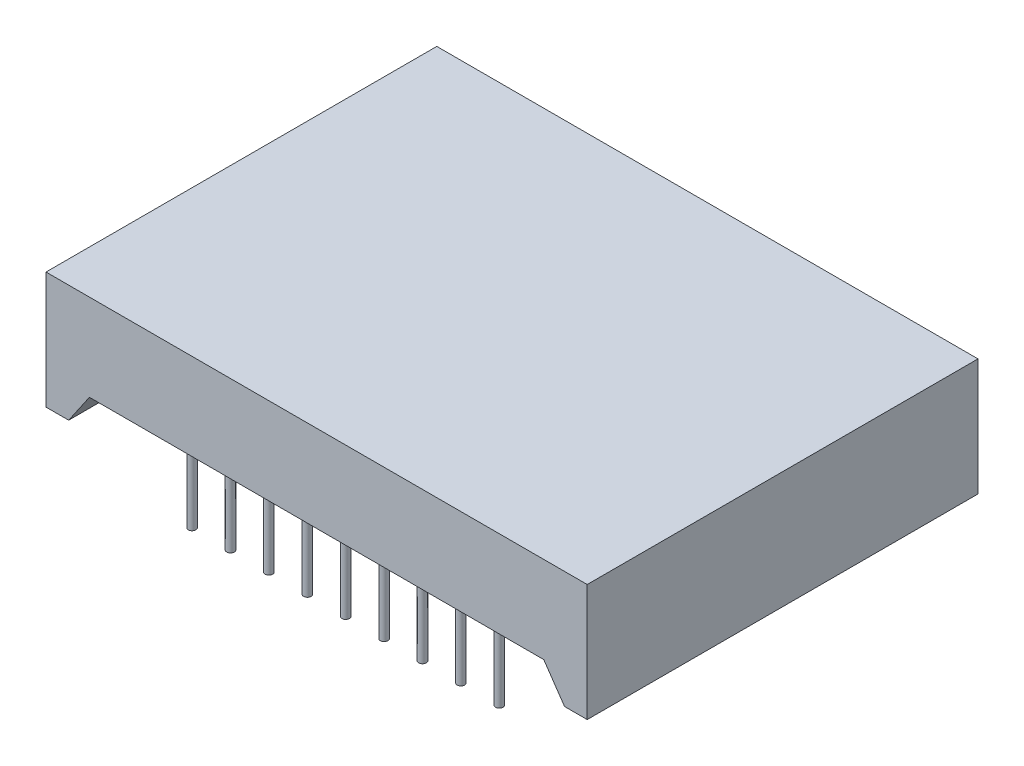
ISO-10303-21;
HEADER;
FILE_DESCRIPTION(('STEP AP214'),'2;1');
FILE_NAME('part.step','',(''),(''),'','','');
FILE_SCHEMA(('AUTOMOTIVE_DESIGN { 1 0 10303 214 1 1 1 1 }'));
ENDSEC;
DATA;
#1=APPLICATION_CONTEXT('core data for automotive mechanical design processes');
#2=APPLICATION_PROTOCOL_DEFINITION('international standard','automotive_design',2000,#1);
#3=PRODUCT_CONTEXT('',#1,'mechanical');
#4=PRODUCT('Part','Part','',(#3));
#5=PRODUCT_RELATED_PRODUCT_CATEGORY('part','',(#4));
#6=PRODUCT_DEFINITION_FORMATION('','',#4);
#7=PRODUCT_DEFINITION_CONTEXT('part definition',#1,'design');
#8=PRODUCT_DEFINITION('design','',#6,#7);
#9=PRODUCT_DEFINITION_SHAPE('','',#8);
#10=(LENGTH_UNIT() NAMED_UNIT(*) SI_UNIT(.MILLI.,.METRE.));
#11=(NAMED_UNIT(*) PLANE_ANGLE_UNIT() SI_UNIT($,.RADIAN.));
#12=(NAMED_UNIT(*) SI_UNIT($,.STERADIAN.) SOLID_ANGLE_UNIT());
#13=UNCERTAINTY_MEASURE_WITH_UNIT(LENGTH_MEASURE(1.E-05),#10,'distance_accuracy_value','');
#14=(GEOMETRIC_REPRESENTATION_CONTEXT(3) GLOBAL_UNCERTAINTY_ASSIGNED_CONTEXT((#13)) GLOBAL_UNIT_ASSIGNED_CONTEXT((#10,
#11,#12)) REPRESENTATION_CONTEXT('',''));
#15=CARTESIAN_POINT('',(0.,0.,0.));
#16=DIRECTION('',(0.,0.,1.));
#17=DIRECTION('',(1.,0.,0.));
#18=AXIS2_PLACEMENT_3D('',#15,#16,#17);
#19=CARTESIAN_POINT('',(0.,7.74,12.925));
#20=DIRECTION('',(0.,0.,1.));
#21=DIRECTION('',(1.,0.,0.));
#22=AXIS2_PLACEMENT_3D('',#19,#20,#21);
#23=PLANE('',#22);
#24=DIRECTION('',(-1.,0.,0.));
#25=VECTOR('',#24,1.);
#26=CARTESIAN_POINT('',(0.,0.,12.925));
#27=LINE('',#26,#25);
#28=CARTESIAN_POINT('',(-16.4,0.,12.925));
#29=VERTEX_POINT('',#28);
#30=CARTESIAN_POINT('',(-17.9,0.,12.925));
#31=VERTEX_POINT('',#30);
#32=EDGE_CURVE('E377',#29,#31,#27,.T.);
#33=ORIENTED_EDGE('',*,*,#32,.F.);
#34=DIRECTION('',(0.56579801906661,0.824543874891022,0.));
#35=VECTOR('',#34,1.);
#36=CARTESIAN_POINT('',(-7.53900491387033,12.9132287097094,12.925));
#37=LINE('',#36,#35);
#38=CARTESIAN_POINT('',(-15.0276096729446,2.,12.925));
#39=VERTEX_POINT('',#38);
#40=EDGE_CURVE('E320',#29,#39,#37,.T.);
#41=ORIENTED_EDGE('',*,*,#40,.T.);
#42=DIRECTION('',(1.,0.,0.));
#43=VECTOR('',#42,1.);
#44=CARTESIAN_POINT('',(0.,2.,12.925));
#45=LINE('',#44,#43);
#46=CARTESIAN_POINT('',(15.0276096729446,2.,12.925));
#47=VERTEX_POINT('',#46);
#48=EDGE_CURVE('E324',#39,#47,#45,.T.);
#49=ORIENTED_EDGE('',*,*,#48,.T.);
#50=DIRECTION('',(0.56579801906661,-0.824543874891021,0.));
#51=VECTOR('',#50,1.);
#52=CARTESIAN_POINT('',(7.53900491387033,12.9132287097094,12.925));
#53=LINE('',#52,#51);
#54=CARTESIAN_POINT('',(16.4,0.,12.925));
#55=VERTEX_POINT('',#54);
#56=EDGE_CURVE('E379',#47,#55,#53,.T.);
#57=ORIENTED_EDGE('',*,*,#56,.T.);
#58=CARTESIAN_POINT('',(17.9,0.,12.925));
#59=VERTEX_POINT('',#58);
#60=EDGE_CURVE('E370',#59,#55,#27,.T.);
#61=ORIENTED_EDGE('',*,*,#60,.F.);
#62=DIRECTION('',(0.,-1.,0.));
#63=VECTOR('',#62,1.);
#64=CARTESIAN_POINT('',(17.9,7.74,12.925));
#65=LINE('',#64,#63);
#66=CARTESIAN_POINT('',(17.9,7.74,12.925));
#67=VERTEX_POINT('',#66);
#68=EDGE_CURVE('E395',#67,#59,#65,.T.);
#69=ORIENTED_EDGE('',*,*,#68,.F.);
#70=DIRECTION('',(-1.,0.,0.));
#71=VECTOR('',#70,1.);
#72=CARTESIAN_POINT('',(0.,7.74,12.925));
#73=LINE('',#72,#71);
#74=CARTESIAN_POINT('',(-17.9,7.74,12.925));
#75=VERTEX_POINT('',#74);
#76=EDGE_CURVE('E502',#67,#75,#73,.T.);
#77=ORIENTED_EDGE('',*,*,#76,.T.);
#78=DIRECTION('',(0.,-1.,0.));
#79=VECTOR('',#78,1.);
#80=CARTESIAN_POINT('',(-17.9,7.74,12.925));
#81=LINE('',#80,#79);
#82=EDGE_CURVE('E389',#75,#31,#81,.T.);
#83=ORIENTED_EDGE('',*,*,#82,.T.);
#84=EDGE_LOOP('',(#33,#41,#49,#57,#61,#69,#77,#83));
#85=FACE_BOUND('',#84,.T.);
#86=ADVANCED_FACE('F305',(#85),#23,.T.);
#87=CARTESIAN_POINT('',(0.,7.74,-12.925));
#88=DIRECTION('',(0.,0.,1.));
#89=DIRECTION('',(1.,0.,0.));
#90=AXIS2_PLACEMENT_3D('',#87,#88,#89);
#91=PLANE('',#90);
#92=DIRECTION('',(0.56579801906661,0.824543874891022,0.));
#93=VECTOR('',#92,1.);
#94=CARTESIAN_POINT('',(-7.53900491387033,12.9132287097094,-12.925));
#95=LINE('',#94,#93);
#96=CARTESIAN_POINT('',(-16.4,0.,-12.925));
#97=VERTEX_POINT('',#96);
#98=CARTESIAN_POINT('',(-15.0276096729446,2.,-12.925));
#99=VERTEX_POINT('',#98);
#100=EDGE_CURVE('E383',#97,#99,#95,.T.);
#101=ORIENTED_EDGE('',*,*,#100,.F.);
#102=DIRECTION('',(-1.,0.,0.));
#103=VECTOR('',#102,1.);
#104=CARTESIAN_POINT('',(0.,0.,-12.925));
#105=LINE('',#104,#103);
#106=CARTESIAN_POINT('',(-17.9,0.,-12.925));
#107=VERTEX_POINT('',#106);
#108=EDGE_CURVE('E515',#97,#107,#105,.T.);
#109=ORIENTED_EDGE('',*,*,#108,.T.);
#110=DIRECTION('',(0.,-1.,0.));
#111=VECTOR('',#110,1.);
#112=CARTESIAN_POINT('',(-17.9,7.74,-12.925));
#113=LINE('',#112,#111);
#114=CARTESIAN_POINT('',(-17.9,7.74,-12.925));
#115=VERTEX_POINT('',#114);
#116=EDGE_CURVE('E511',#115,#107,#113,.T.);
#117=ORIENTED_EDGE('',*,*,#116,.F.);
#118=DIRECTION('',(-1.,0.,0.));
#119=VECTOR('',#118,1.);
#120=CARTESIAN_POINT('',(0.,7.74,-12.925));
#121=LINE('',#120,#119);
#122=CARTESIAN_POINT('',(17.9,7.74,-12.925));
#123=VERTEX_POINT('',#122);
#124=EDGE_CURVE('E509',#123,#115,#121,.T.);
#125=ORIENTED_EDGE('',*,*,#124,.F.);
#126=DIRECTION('',(0.,-1.,0.));
#127=VECTOR('',#126,1.);
#128=CARTESIAN_POINT('',(17.9,7.74,-12.925));
#129=LINE('',#128,#127);
#130=CARTESIAN_POINT('',(17.9,0.,-12.925));
#131=VERTEX_POINT('',#130);
#132=EDGE_CURVE('E519',#123,#131,#129,.T.);
#133=ORIENTED_EDGE('',*,*,#132,.T.);
#134=CARTESIAN_POINT('',(16.4,0.,-12.925));
#135=VERTEX_POINT('',#134);
#136=EDGE_CURVE('E503',#131,#135,#105,.T.);
#137=ORIENTED_EDGE('',*,*,#136,.T.);
#138=DIRECTION('',(0.56579801906661,-0.824543874891021,0.));
#139=VECTOR('',#138,1.);
#140=CARTESIAN_POINT('',(7.53900491387033,12.9132287097094,-12.925));
#141=LINE('',#140,#139);
#142=CARTESIAN_POINT('',(15.0276096729446,2.,-12.925));
#143=VERTEX_POINT('',#142);
#144=EDGE_CURVE('E384',#143,#135,#141,.T.);
#145=ORIENTED_EDGE('',*,*,#144,.F.);
#146=DIRECTION('',(1.,0.,0.));
#147=VECTOR('',#146,1.);
#148=CARTESIAN_POINT('',(0.,2.,-12.925));
#149=LINE('',#148,#147);
#150=EDGE_CURVE('E392',#99,#143,#149,.T.);
#151=ORIENTED_EDGE('',*,*,#150,.F.);
#152=EDGE_LOOP('',(#101,#109,#117,#125,#133,#137,#145,#151));
#153=FACE_BOUND('',#152,.T.);
#154=ADVANCED_FACE('F535',(#153),#91,.F.);
#155=CARTESIAN_POINT('',(0.,0.,0.));
#156=DIRECTION('',(0.,1.,0.));
#157=DIRECTION('',(0.,0.,1.));
#158=AXIS2_PLACEMENT_3D('',#155,#156,#157);
#159=PLANE('',#158);
#160=DIRECTION('',(0.,0.,-1.));
#161=VECTOR('',#160,1.);
#162=CARTESIAN_POINT('',(-16.4,0.,0.));
#163=LINE('',#162,#161);
#164=EDGE_CURVE('E388',#29,#97,#163,.T.);
#165=ORIENTED_EDGE('',*,*,#164,.F.);
#166=ORIENTED_EDGE('',*,*,#32,.T.);
#167=DIRECTION('',(0.,0.,-1.));
#168=VECTOR('',#167,1.);
#169=CARTESIAN_POINT('',(-17.9,0.,0.));
#170=LINE('',#169,#168);
#171=EDGE_CURVE('E488',#31,#107,#170,.T.);
#172=ORIENTED_EDGE('',*,*,#171,.T.);
#173=ORIENTED_EDGE('',*,*,#108,.F.);
#174=EDGE_LOOP('',(#165,#166,#172,#173));
#175=FACE_BOUND('',#174,.T.);
#176=ADVANCED_FACE('F533',(#175),#159,.F.);
#177=DIRECTION('',(0.,0.,1.));
#178=VECTOR('',#177,1.);
#179=CARTESIAN_POINT('',(16.4,0.,0.));
#180=LINE('',#179,#178);
#181=EDGE_CURVE('E373',#135,#55,#180,.T.);
#182=ORIENTED_EDGE('',*,*,#181,.F.);
#183=ORIENTED_EDGE('',*,*,#136,.F.);
#184=DIRECTION('',(0.,0.,-1.));
#185=VECTOR('',#184,1.);
#186=CARTESIAN_POINT('',(17.9,0.,0.));
#187=LINE('',#186,#185);
#188=EDGE_CURVE('E376',#59,#131,#187,.T.);
#189=ORIENTED_EDGE('',*,*,#188,.F.);
#190=ORIENTED_EDGE('',*,*,#60,.T.);
#191=EDGE_LOOP('',(#182,#183,#189,#190));
#192=FACE_BOUND('',#191,.T.);
#193=ADVANCED_FACE('F371',(#192),#159,.F.);
#194=CARTESIAN_POINT('',(17.9,7.74,0.));
#195=DIRECTION('',(-1.,0.,0.));
#196=DIRECTION('',(0.,0.,1.));
#197=AXIS2_PLACEMENT_3D('',#194,#195,#196);
#198=PLANE('',#197);
#199=ORIENTED_EDGE('',*,*,#188,.T.);
#200=ORIENTED_EDGE('',*,*,#132,.F.);
#201=DIRECTION('',(0.,0.,-1.));
#202=VECTOR('',#201,1.);
#203=CARTESIAN_POINT('',(17.9,7.74,0.));
#204=LINE('',#203,#202);
#205=EDGE_CURVE('E506',#67,#123,#204,.T.);
#206=ORIENTED_EDGE('',*,*,#205,.F.);
#207=ORIENTED_EDGE('',*,*,#68,.T.);
#208=EDGE_LOOP('',(#199,#200,#206,#207));
#209=FACE_BOUND('',#208,.T.);
#210=ADVANCED_FACE('F523',(#209),#198,.F.);
#211=CARTESIAN_POINT('',(-17.9,7.74,0.));
#212=DIRECTION('',(-1.,0.,0.));
#213=DIRECTION('',(0.,0.,1.));
#214=AXIS2_PLACEMENT_3D('',#211,#212,#213);
#215=PLANE('',#214);
#216=ORIENTED_EDGE('',*,*,#171,.F.);
#217=ORIENTED_EDGE('',*,*,#82,.F.);
#218=DIRECTION('',(0.,0.,-1.));
#219=VECTOR('',#218,1.);
#220=CARTESIAN_POINT('',(-17.9,7.74,0.));
#221=LINE('',#220,#219);
#222=EDGE_CURVE('E499',#75,#115,#221,.T.);
#223=ORIENTED_EDGE('',*,*,#222,.T.);
#224=ORIENTED_EDGE('',*,*,#116,.T.);
#225=EDGE_LOOP('',(#216,#217,#223,#224));
#226=FACE_BOUND('',#225,.T.);
#227=ADVANCED_FACE('F307',(#226),#215,.T.);
#228=CARTESIAN_POINT('',(0.,7.74,0.));
#229=DIRECTION('',(0.,1.,0.));
#230=DIRECTION('',(0.,0.,1.));
#231=AXIS2_PLACEMENT_3D('',#228,#229,#230);
#232=PLANE('',#231);
#233=ORIENTED_EDGE('',*,*,#222,.F.);
#234=ORIENTED_EDGE('',*,*,#76,.F.);
#235=ORIENTED_EDGE('',*,*,#205,.T.);
#236=ORIENTED_EDGE('',*,*,#124,.T.);
#237=EDGE_LOOP('',(#233,#234,#235,#236));
#238=FACE_BOUND('',#237,.T.);
#239=ADVANCED_FACE('F431',(#238),#232,.T.);
#240=CARTESIAN_POINT('',(-15.0276096729446,2.,68.9630743892043));
#241=DIRECTION('',(0.,-1.,0.));
#242=DIRECTION('',(1.,0.,0.));
#243=AXIS2_PLACEMENT_3D('',#240,#241,#242);
#244=PLANE('',#243);
#245=CARTESIAN_POINT('',(10.16,2.00000000000955,-11.));
#246=DIRECTION('',(0.,-1.,0.));
#247=DIRECTION('',(1.,0.,0.));
#248=AXIS2_PLACEMENT_3D('',#245,#246,#247);
#249=CIRCLE('',#248,0.25);
#250=CARTESIAN_POINT('',(10.41,2.00000000000955,-11.));
#251=VERTEX_POINT('',#250);
#252=EDGE_CURVE('E12',#251,#251,#249,.T.);
#253=ORIENTED_EDGE('',*,*,#252,.F.);
#254=EDGE_LOOP('',(#253));
#255=FACE_BOUND('',#254,.T.);
#256=CARTESIAN_POINT('',(7.61999999999999,2.00000000000955,-11.));
#257=DIRECTION('',(0.,-1.,0.));
#258=DIRECTION('',(1.,0.,0.));
#259=AXIS2_PLACEMENT_3D('',#256,#257,#258);
#260=CIRCLE('',#259,0.25);
#261=CARTESIAN_POINT('',(7.86999999999999,2.00000000000955,-11.));
#262=VERTEX_POINT('',#261);
#263=EDGE_CURVE('E313',#262,#262,#260,.T.);
#264=ORIENTED_EDGE('',*,*,#263,.F.);
#265=EDGE_LOOP('',(#264));
#266=FACE_BOUND('',#265,.T.);
#267=CARTESIAN_POINT('',(5.07999999999999,2.00000000000955,-11.));
#268=DIRECTION('',(0.,-1.,0.));
#269=DIRECTION('',(1.,0.,0.));
#270=AXIS2_PLACEMENT_3D('',#267,#268,#269);
#271=CIRCLE('',#270,0.25);
#272=CARTESIAN_POINT('',(5.32999999999999,2.00000000000955,-11.));
#273=VERTEX_POINT('',#272);
#274=EDGE_CURVE('E419',#273,#273,#271,.T.);
#275=ORIENTED_EDGE('',*,*,#274,.F.);
#276=EDGE_LOOP('',(#275));
#277=FACE_BOUND('',#276,.T.);
#278=CARTESIAN_POINT('',(2.54,2.00000000000955,-11.));
#279=DIRECTION('',(0.,-1.,0.));
#280=DIRECTION('',(1.,0.,0.));
#281=AXIS2_PLACEMENT_3D('',#278,#279,#280);
#282=CIRCLE('',#281,0.25);
#283=CARTESIAN_POINT('',(2.79,2.00000000000955,-11.));
#284=VERTEX_POINT('',#283);
#285=EDGE_CURVE('E416',#284,#284,#282,.T.);
#286=ORIENTED_EDGE('',*,*,#285,.F.);
#287=EDGE_LOOP('',(#286));
#288=FACE_BOUND('',#287,.T.);
#289=CARTESIAN_POINT('',(0.,2.00000000000955,-11.));
#290=DIRECTION('',(0.,-1.,0.));
#291=DIRECTION('',(1.,0.,0.));
#292=AXIS2_PLACEMENT_3D('',#289,#290,#291);
#293=CIRCLE('',#292,0.25);
#294=CARTESIAN_POINT('',(0.249999999999996,2.00000000000955,-11.));
#295=VERTEX_POINT('',#294);
#296=EDGE_CURVE('E413',#295,#295,#293,.T.);
#297=ORIENTED_EDGE('',*,*,#296,.F.);
#298=EDGE_LOOP('',(#297));
#299=FACE_BOUND('',#298,.T.);
#300=CARTESIAN_POINT('',(-2.54,2.00000000000955,-11.));
#301=DIRECTION('',(0.,-1.,0.));
#302=DIRECTION('',(1.,0.,0.));
#303=AXIS2_PLACEMENT_3D('',#300,#301,#302);
#304=CIRCLE('',#303,0.25);
#305=CARTESIAN_POINT('',(-2.29,2.00000000000955,-11.));
#306=VERTEX_POINT('',#305);
#307=EDGE_CURVE('E410',#306,#306,#304,.T.);
#308=ORIENTED_EDGE('',*,*,#307,.F.);
#309=EDGE_LOOP('',(#308));
#310=FACE_BOUND('',#309,.T.);
#311=CARTESIAN_POINT('',(-5.08,2.00000000000955,-11.));
#312=DIRECTION('',(0.,-1.,0.));
#313=DIRECTION('',(1.,0.,0.));
#314=AXIS2_PLACEMENT_3D('',#311,#312,#313);
#315=CIRCLE('',#314,0.25);
#316=CARTESIAN_POINT('',(-4.83,2.00000000000955,-11.));
#317=VERTEX_POINT('',#316);
#318=EDGE_CURVE('E407',#317,#317,#315,.T.);
#319=ORIENTED_EDGE('',*,*,#318,.F.);
#320=EDGE_LOOP('',(#319));
#321=FACE_BOUND('',#320,.T.);
#322=CARTESIAN_POINT('',(-7.62,2.00000000000955,-11.));
#323=DIRECTION('',(0.,-1.,0.));
#324=DIRECTION('',(1.,0.,0.));
#325=AXIS2_PLACEMENT_3D('',#322,#323,#324);
#326=CIRCLE('',#325,0.25);
#327=CARTESIAN_POINT('',(-7.37,2.00000000000955,-11.));
#328=VERTEX_POINT('',#327);
#329=EDGE_CURVE('E404',#328,#328,#326,.T.);
#330=ORIENTED_EDGE('',*,*,#329,.F.);
#331=EDGE_LOOP('',(#330));
#332=FACE_BOUND('',#331,.T.);
#333=CARTESIAN_POINT('',(-10.16,2.00000000000955,-11.));
#334=DIRECTION('',(0.,-1.,0.));
#335=DIRECTION('',(1.,0.,0.));
#336=AXIS2_PLACEMENT_3D('',#333,#334,#335);
#337=CIRCLE('',#336,0.25);
#338=CARTESIAN_POINT('',(-9.91,2.00000000000955,-11.));
#339=VERTEX_POINT('',#338);
#340=EDGE_CURVE('E401',#339,#339,#337,.T.);
#341=ORIENTED_EDGE('',*,*,#340,.F.);
#342=EDGE_LOOP('',(#341));
#343=FACE_BOUND('',#342,.T.);
#344=CARTESIAN_POINT('',(10.16,2.00000000000955,11.));
#345=DIRECTION('',(0.,-1.,0.));
#346=DIRECTION('',(1.,0.,0.));
#347=AXIS2_PLACEMENT_3D('',#344,#345,#346);
#348=CIRCLE('',#347,0.25);
#349=CARTESIAN_POINT('',(10.41,2.00000000000955,11.));
#350=VERTEX_POINT('',#349);
#351=EDGE_CURVE('E451',#350,#350,#348,.T.);
#352=ORIENTED_EDGE('',*,*,#351,.F.);
#353=EDGE_LOOP('',(#352));
#354=FACE_BOUND('',#353,.T.);
#355=CARTESIAN_POINT('',(7.61999999999999,2.00000000000955,11.));
#356=DIRECTION('',(0.,-1.,0.));
#357=DIRECTION('',(1.,0.,0.));
#358=AXIS2_PLACEMENT_3D('',#355,#356,#357);
#359=CIRCLE('',#358,0.25);
#360=CARTESIAN_POINT('',(7.86999999999999,2.00000000000955,11.));
#361=VERTEX_POINT('',#360);
#362=EDGE_CURVE('E455',#361,#361,#359,.T.);
#363=ORIENTED_EDGE('',*,*,#362,.F.);
#364=EDGE_LOOP('',(#363));
#365=FACE_BOUND('',#364,.T.);
#366=CARTESIAN_POINT('',(5.07999999999999,2.00000000000955,11.));
#367=DIRECTION('',(0.,-1.,0.));
#368=DIRECTION('',(1.,0.,0.));
#369=AXIS2_PLACEMENT_3D('',#366,#367,#368);
#370=CIRCLE('',#369,0.25);
#371=CARTESIAN_POINT('',(5.32999999999999,2.00000000000955,11.));
#372=VERTEX_POINT('',#371);
#373=EDGE_CURVE('E459',#372,#372,#370,.T.);
#374=ORIENTED_EDGE('',*,*,#373,.F.);
#375=EDGE_LOOP('',(#374));
#376=FACE_BOUND('',#375,.T.);
#377=CARTESIAN_POINT('',(2.54,2.00000000000955,11.));
#378=DIRECTION('',(0.,-1.,0.));
#379=DIRECTION('',(1.,0.,0.));
#380=AXIS2_PLACEMENT_3D('',#377,#378,#379);
#381=CIRCLE('',#380,0.25);
#382=CARTESIAN_POINT('',(2.79,2.00000000000955,11.));
#383=VERTEX_POINT('',#382);
#384=EDGE_CURVE('E463',#383,#383,#381,.T.);
#385=ORIENTED_EDGE('',*,*,#384,.F.);
#386=EDGE_LOOP('',(#385));
#387=FACE_BOUND('',#386,.T.);
#388=CARTESIAN_POINT('',(0.,2.00000000000955,11.));
#389=DIRECTION('',(0.,-1.,0.));
#390=DIRECTION('',(1.,0.,0.));
#391=AXIS2_PLACEMENT_3D('',#388,#389,#390);
#392=CIRCLE('',#391,0.25);
#393=CARTESIAN_POINT('',(0.249999999999996,2.00000000000955,11.));
#394=VERTEX_POINT('',#393);
#395=EDGE_CURVE('E467',#394,#394,#392,.T.);
#396=ORIENTED_EDGE('',*,*,#395,.F.);
#397=EDGE_LOOP('',(#396));
#398=FACE_BOUND('',#397,.T.);
#399=CARTESIAN_POINT('',(-2.54,2.00000000000955,11.));
#400=DIRECTION('',(0.,-1.,0.));
#401=DIRECTION('',(1.,0.,0.));
#402=AXIS2_PLACEMENT_3D('',#399,#400,#401);
#403=CIRCLE('',#402,0.25);
#404=CARTESIAN_POINT('',(-2.29,2.00000000000955,11.));
#405=VERTEX_POINT('',#404);
#406=EDGE_CURVE('E471',#405,#405,#403,.T.);
#407=ORIENTED_EDGE('',*,*,#406,.F.);
#408=EDGE_LOOP('',(#407));
#409=FACE_BOUND('',#408,.T.);
#410=CARTESIAN_POINT('',(-5.08,2.00000000000955,11.));
#411=DIRECTION('',(0.,-1.,0.));
#412=DIRECTION('',(1.,0.,0.));
#413=AXIS2_PLACEMENT_3D('',#410,#411,#412);
#414=CIRCLE('',#413,0.25);
#415=CARTESIAN_POINT('',(-4.83,2.00000000000955,11.));
#416=VERTEX_POINT('',#415);
#417=EDGE_CURVE('E475',#416,#416,#414,.T.);
#418=ORIENTED_EDGE('',*,*,#417,.F.);
#419=EDGE_LOOP('',(#418));
#420=FACE_BOUND('',#419,.T.);
#421=CARTESIAN_POINT('',(-7.62,2.00000000000955,11.));
#422=DIRECTION('',(0.,-1.,0.));
#423=DIRECTION('',(1.,0.,0.));
#424=AXIS2_PLACEMENT_3D('',#421,#422,#423);
#425=CIRCLE('',#424,0.25);
#426=CARTESIAN_POINT('',(-7.37,2.00000000000955,11.));
#427=VERTEX_POINT('',#426);
#428=EDGE_CURVE('E479',#427,#427,#425,.T.);
#429=ORIENTED_EDGE('',*,*,#428,.F.);
#430=EDGE_LOOP('',(#429));
#431=FACE_BOUND('',#430,.T.);
#432=CARTESIAN_POINT('',(-10.16,2.00000000000955,11.));
#433=DIRECTION('',(0.,-1.,0.));
#434=DIRECTION('',(1.,0.,0.));
#435=AXIS2_PLACEMENT_3D('',#432,#433,#434);
#436=CIRCLE('',#435,0.25);
#437=CARTESIAN_POINT('',(-9.91,2.00000000000955,11.));
#438=VERTEX_POINT('',#437);
#439=EDGE_CURVE('E483',#438,#438,#436,.T.);
#440=ORIENTED_EDGE('',*,*,#439,.F.);
#441=EDGE_LOOP('',(#440));
#442=FACE_BOUND('',#441,.T.);
#443=ORIENTED_EDGE('',*,*,#48,.F.);
#444=DIRECTION('',(0.,0.,-1.));
#445=VECTOR('',#444,1.);
#446=CARTESIAN_POINT('',(-15.0276096729446,2.,68.9630743892043));
#447=LINE('',#446,#445);
#448=EDGE_CURVE('E486',#39,#99,#447,.T.);
#449=ORIENTED_EDGE('',*,*,#448,.T.);
#450=ORIENTED_EDGE('',*,*,#150,.T.);
#451=DIRECTION('',(0.,0.,-1.));
#452=VECTOR('',#451,1.);
#453=CARTESIAN_POINT('',(15.0276096729446,2.,68.9630743892043));
#454=LINE('',#453,#452);
#455=EDGE_CURVE('E487',#47,#143,#454,.T.);
#456=ORIENTED_EDGE('',*,*,#455,.F.);
#457=EDGE_LOOP('',(#443,#449,#450,#456));
#458=FACE_BOUND('',#457,.T.);
#459=ADVANCED_FACE('F427',(#255,#266,#277,#288,#299,#310,#321,#332,#343,#354,#365,#376,#387,
#398,#409,#420,#431,#442,#458),#244,.T.);
#460=CARTESIAN_POINT('',(-16.4,0.,68.9630743892043));
#461=DIRECTION('',(0.824543874891021,-0.56579801906661,0.));
#462=DIRECTION('',(0.56579801906661,0.824543874891021,0.));
#463=AXIS2_PLACEMENT_3D('',#460,#461,#462);
#464=PLANE('',#463);
#465=ORIENTED_EDGE('',*,*,#40,.F.);
#466=ORIENTED_EDGE('',*,*,#164,.T.);
#467=ORIENTED_EDGE('',*,*,#100,.T.);
#468=ORIENTED_EDGE('',*,*,#448,.F.);
#469=EDGE_LOOP('',(#465,#466,#467,#468));
#470=FACE_BOUND('',#469,.T.);
#471=ADVANCED_FACE('F430',(#470),#464,.T.);
#472=CARTESIAN_POINT('',(16.4,0.,68.9630743892043));
#473=DIRECTION('',(-0.824543874891021,-0.56579801906661,0.));
#474=DIRECTION('',(0.56579801906661,-0.824543874891021,0.));
#475=AXIS2_PLACEMENT_3D('',#472,#473,#474);
#476=PLANE('',#475);
#477=ORIENTED_EDGE('',*,*,#56,.F.);
#478=ORIENTED_EDGE('',*,*,#455,.T.);
#479=ORIENTED_EDGE('',*,*,#144,.T.);
#480=ORIENTED_EDGE('',*,*,#181,.T.);
#481=EDGE_LOOP('',(#477,#478,#479,#480));
#482=FACE_BOUND('',#481,.T.);
#483=ADVANCED_FACE('F387',(#482),#476,.T.);
#484=CARTESIAN_POINT('',(-10.16,500000.,11.));
#485=DIRECTION('',(0.,-1.,0.));
#486=DIRECTION('',(0.,0.,-1.));
#487=AXIS2_PLACEMENT_3D('',#484,#485,#486);
#488=CYLINDRICAL_SURFACE('',#487,0.25);
#489=ORIENTED_EDGE('',*,*,#439,.T.);
#490=EDGE_LOOP('',(#489));
#491=FACE_BOUND('',#490,.T.);
#492=CARTESIAN_POINT('',(-10.16,-4.,11.));
#493=DIRECTION('',(0.,1.,0.));
#494=DIRECTION('',(0.,0.,1.));
#495=AXIS2_PLACEMENT_3D('',#492,#493,#494);
#496=CIRCLE('',#495,0.25);
#497=CARTESIAN_POINT('',(-10.16,-4.,11.25));
#498=VERTEX_POINT('',#497);
#499=EDGE_CURVE('E1029',#498,#498,#496,.T.);
#500=ORIENTED_EDGE('',*,*,#499,.T.);
#501=EDGE_LOOP('',(#500));
#502=FACE_BOUND('',#501,.T.);
#503=ADVANCED_FACE('F604',(#491,#502),#488,.T.);
#504=CARTESIAN_POINT('',(-10.16,-4.,11.));
#505=DIRECTION('',(0.,1.,0.));
#506=DIRECTION('',(0.,0.,1.));
#507=AXIS2_PLACEMENT_3D('',#504,#505,#506);
#508=PLANE('',#507);
#509=ORIENTED_EDGE('',*,*,#499,.F.);
#510=EDGE_LOOP('',(#509));
#511=FACE_BOUND('',#510,.T.);
#512=ADVANCED_FACE('F610',(#511),#508,.F.);
#513=CARTESIAN_POINT('',(-7.62,500000.,11.));
#514=DIRECTION('',(0.,-1.,0.));
#515=DIRECTION('',(0.,0.,-1.));
#516=AXIS2_PLACEMENT_3D('',#513,#514,#515);
#517=CYLINDRICAL_SURFACE('',#516,0.25);
#518=ORIENTED_EDGE('',*,*,#428,.T.);
#519=EDGE_LOOP('',(#518));
#520=FACE_BOUND('',#519,.T.);
#521=CARTESIAN_POINT('',(-7.62,-4.,11.));
#522=DIRECTION('',(0.,1.,0.));
#523=DIRECTION('',(0.,0.,1.));
#524=AXIS2_PLACEMENT_3D('',#521,#522,#523);
#525=CIRCLE('',#524,0.25);
#526=CARTESIAN_POINT('',(-7.62,-4.,11.25));
#527=VERTEX_POINT('',#526);
#528=EDGE_CURVE('E1026',#527,#527,#525,.T.);
#529=ORIENTED_EDGE('',*,*,#528,.T.);
#530=EDGE_LOOP('',(#529));
#531=FACE_BOUND('',#530,.T.);
#532=ADVANCED_FACE('F618',(#520,#531),#517,.T.);
#533=CARTESIAN_POINT('',(-7.62,-4.,11.));
#534=DIRECTION('',(0.,1.,0.));
#535=DIRECTION('',(0.,0.,1.));
#536=AXIS2_PLACEMENT_3D('',#533,#534,#535);
#537=PLANE('',#536);
#538=ORIENTED_EDGE('',*,*,#528,.F.);
#539=EDGE_LOOP('',(#538));
#540=FACE_BOUND('',#539,.T.);
#541=ADVANCED_FACE('F626',(#540),#537,.F.);
#542=CARTESIAN_POINT('',(-5.08,500000.,11.));
#543=DIRECTION('',(0.,-1.,0.));
#544=DIRECTION('',(0.,0.,-1.));
#545=AXIS2_PLACEMENT_3D('',#542,#543,#544);
#546=CYLINDRICAL_SURFACE('',#545,0.25);
#547=ORIENTED_EDGE('',*,*,#417,.T.);
#548=EDGE_LOOP('',(#547));
#549=FACE_BOUND('',#548,.T.);
#550=CARTESIAN_POINT('',(-5.08,-4.,11.));
#551=DIRECTION('',(0.,1.,0.));
#552=DIRECTION('',(0.,0.,1.));
#553=AXIS2_PLACEMENT_3D('',#550,#551,#552);
#554=CIRCLE('',#553,0.25);
#555=CARTESIAN_POINT('',(-5.08,-4.,11.25));
#556=VERTEX_POINT('',#555);
#557=EDGE_CURVE('E1022',#556,#556,#554,.T.);
#558=ORIENTED_EDGE('',*,*,#557,.T.);
#559=EDGE_LOOP('',(#558));
#560=FACE_BOUND('',#559,.T.);
#561=ADVANCED_FACE('F634',(#549,#560),#546,.T.);
#562=CARTESIAN_POINT('',(-5.08,-4.,11.));
#563=DIRECTION('',(0.,1.,0.));
#564=DIRECTION('',(0.,0.,1.));
#565=AXIS2_PLACEMENT_3D('',#562,#563,#564);
#566=PLANE('',#565);
#567=ORIENTED_EDGE('',*,*,#557,.F.);
#568=EDGE_LOOP('',(#567));
#569=FACE_BOUND('',#568,.T.);
#570=ADVANCED_FACE('F642',(#569),#566,.F.);
#571=CARTESIAN_POINT('',(-2.54,500000.,11.));
#572=DIRECTION('',(0.,-1.,0.));
#573=DIRECTION('',(0.,0.,-1.));
#574=AXIS2_PLACEMENT_3D('',#571,#572,#573);
#575=CYLINDRICAL_SURFACE('',#574,0.25);
#576=ORIENTED_EDGE('',*,*,#406,.T.);
#577=EDGE_LOOP('',(#576));
#578=FACE_BOUND('',#577,.T.);
#579=CARTESIAN_POINT('',(-2.54,-4.,11.));
#580=DIRECTION('',(0.,1.,0.));
#581=DIRECTION('',(0.,0.,1.));
#582=AXIS2_PLACEMENT_3D('',#579,#580,#581);
#583=CIRCLE('',#582,0.25);
#584=CARTESIAN_POINT('',(-2.54,-4.,11.25));
#585=VERTEX_POINT('',#584);
#586=EDGE_CURVE('E1018',#585,#585,#583,.T.);
#587=ORIENTED_EDGE('',*,*,#586,.T.);
#588=EDGE_LOOP('',(#587));
#589=FACE_BOUND('',#588,.T.);
#590=ADVANCED_FACE('F650',(#578,#589),#575,.T.);
#591=CARTESIAN_POINT('',(-2.54,-4.,11.));
#592=DIRECTION('',(0.,1.,0.));
#593=DIRECTION('',(0.,0.,1.));
#594=AXIS2_PLACEMENT_3D('',#591,#592,#593);
#595=PLANE('',#594);
#596=ORIENTED_EDGE('',*,*,#586,.F.);
#597=EDGE_LOOP('',(#596));
#598=FACE_BOUND('',#597,.T.);
#599=ADVANCED_FACE('F658',(#598),#595,.F.);
#600=CARTESIAN_POINT('',(0.,500000.,11.));
#601=DIRECTION('',(0.,-1.,0.));
#602=DIRECTION('',(0.,0.,-1.));
#603=AXIS2_PLACEMENT_3D('',#600,#601,#602);
#604=CYLINDRICAL_SURFACE('',#603,0.25);
#605=ORIENTED_EDGE('',*,*,#395,.T.);
#606=EDGE_LOOP('',(#605));
#607=FACE_BOUND('',#606,.T.);
#608=CARTESIAN_POINT('',(0.,-4.,11.));
#609=DIRECTION('',(0.,1.,0.));
#610=DIRECTION('',(0.,0.,1.));
#611=AXIS2_PLACEMENT_3D('',#608,#609,#610);
#612=CIRCLE('',#611,0.25);
#613=CARTESIAN_POINT('',(0.,-4.,11.25));
#614=VERTEX_POINT('',#613);
#615=EDGE_CURVE('E1014',#614,#614,#612,.T.);
#616=ORIENTED_EDGE('',*,*,#615,.T.);
#617=EDGE_LOOP('',(#616));
#618=FACE_BOUND('',#617,.T.);
#619=ADVANCED_FACE('F666',(#607,#618),#604,.T.);
#620=CARTESIAN_POINT('',(0.,-4.,11.));
#621=DIRECTION('',(0.,1.,0.));
#622=DIRECTION('',(0.,0.,1.));
#623=AXIS2_PLACEMENT_3D('',#620,#621,#622);
#624=PLANE('',#623);
#625=ORIENTED_EDGE('',*,*,#615,.F.);
#626=EDGE_LOOP('',(#625));
#627=FACE_BOUND('',#626,.T.);
#628=ADVANCED_FACE('F674',(#627),#624,.F.);
#629=CARTESIAN_POINT('',(2.54,500000.,11.));
#630=DIRECTION('',(0.,-1.,0.));
#631=DIRECTION('',(0.,0.,-1.));
#632=AXIS2_PLACEMENT_3D('',#629,#630,#631);
#633=CYLINDRICAL_SURFACE('',#632,0.25);
#634=ORIENTED_EDGE('',*,*,#384,.T.);
#635=EDGE_LOOP('',(#634));
#636=FACE_BOUND('',#635,.T.);
#637=CARTESIAN_POINT('',(2.54,-4.,11.));
#638=DIRECTION('',(0.,1.,0.));
#639=DIRECTION('',(0.,0.,1.));
#640=AXIS2_PLACEMENT_3D('',#637,#638,#639);
#641=CIRCLE('',#640,0.25);
#642=CARTESIAN_POINT('',(2.54,-4.,11.25));
#643=VERTEX_POINT('',#642);
#644=EDGE_CURVE('E1010',#643,#643,#641,.T.);
#645=ORIENTED_EDGE('',*,*,#644,.T.);
#646=EDGE_LOOP('',(#645));
#647=FACE_BOUND('',#646,.T.);
#648=ADVANCED_FACE('F682',(#636,#647),#633,.T.);
#649=CARTESIAN_POINT('',(2.54,-4.,11.));
#650=DIRECTION('',(0.,1.,0.));
#651=DIRECTION('',(0.,0.,1.));
#652=AXIS2_PLACEMENT_3D('',#649,#650,#651);
#653=PLANE('',#652);
#654=ORIENTED_EDGE('',*,*,#644,.F.);
#655=EDGE_LOOP('',(#654));
#656=FACE_BOUND('',#655,.T.);
#657=ADVANCED_FACE('F690',(#656),#653,.F.);
#658=CARTESIAN_POINT('',(5.07999999999999,500000.,11.));
#659=DIRECTION('',(0.,-1.,0.));
#660=DIRECTION('',(0.,0.,-1.));
#661=AXIS2_PLACEMENT_3D('',#658,#659,#660);
#662=CYLINDRICAL_SURFACE('',#661,0.25);
#663=ORIENTED_EDGE('',*,*,#373,.T.);
#664=EDGE_LOOP('',(#663));
#665=FACE_BOUND('',#664,.T.);
#666=CARTESIAN_POINT('',(5.07999999999999,-4.,11.));
#667=DIRECTION('',(0.,1.,0.));
#668=DIRECTION('',(0.,0.,1.));
#669=AXIS2_PLACEMENT_3D('',#666,#667,#668);
#670=CIRCLE('',#669,0.25);
#671=CARTESIAN_POINT('',(5.07999999999999,-4.,11.25));
#672=VERTEX_POINT('',#671);
#673=EDGE_CURVE('E1006',#672,#672,#670,.T.);
#674=ORIENTED_EDGE('',*,*,#673,.T.);
#675=EDGE_LOOP('',(#674));
#676=FACE_BOUND('',#675,.T.);
#677=ADVANCED_FACE('F698',(#665,#676),#662,.T.);
#678=CARTESIAN_POINT('',(5.07999999999999,-4.,11.));
#679=DIRECTION('',(0.,1.,0.));
#680=DIRECTION('',(0.,0.,1.));
#681=AXIS2_PLACEMENT_3D('',#678,#679,#680);
#682=PLANE('',#681);
#683=ORIENTED_EDGE('',*,*,#673,.F.);
#684=EDGE_LOOP('',(#683));
#685=FACE_BOUND('',#684,.T.);
#686=ADVANCED_FACE('F706',(#685),#682,.F.);
#687=CARTESIAN_POINT('',(7.61999999999999,500000.,11.));
#688=DIRECTION('',(0.,-1.,0.));
#689=DIRECTION('',(0.,0.,-1.));
#690=AXIS2_PLACEMENT_3D('',#687,#688,#689);
#691=CYLINDRICAL_SURFACE('',#690,0.25);
#692=ORIENTED_EDGE('',*,*,#362,.T.);
#693=EDGE_LOOP('',(#692));
#694=FACE_BOUND('',#693,.T.);
#695=CARTESIAN_POINT('',(7.61999999999999,-4.,11.));
#696=DIRECTION('',(0.,1.,0.));
#697=DIRECTION('',(0.,0.,1.));
#698=AXIS2_PLACEMENT_3D('',#695,#696,#697);
#699=CIRCLE('',#698,0.25);
#700=CARTESIAN_POINT('',(7.61999999999999,-4.,11.25));
#701=VERTEX_POINT('',#700);
#702=EDGE_CURVE('E1002',#701,#701,#699,.T.);
#703=ORIENTED_EDGE('',*,*,#702,.T.);
#704=EDGE_LOOP('',(#703));
#705=FACE_BOUND('',#704,.T.);
#706=ADVANCED_FACE('F714',(#694,#705),#691,.T.);
#707=CARTESIAN_POINT('',(7.61999999999999,-4.,11.));
#708=DIRECTION('',(0.,1.,0.));
#709=DIRECTION('',(0.,0.,1.));
#710=AXIS2_PLACEMENT_3D('',#707,#708,#709);
#711=PLANE('',#710);
#712=ORIENTED_EDGE('',*,*,#702,.F.);
#713=EDGE_LOOP('',(#712));
#714=FACE_BOUND('',#713,.T.);
#715=ADVANCED_FACE('F722',(#714),#711,.F.);
#716=CARTESIAN_POINT('',(10.16,500000.,11.));
#717=DIRECTION('',(0.,-1.,0.));
#718=DIRECTION('',(0.,0.,-1.));
#719=AXIS2_PLACEMENT_3D('',#716,#717,#718);
#720=CYLINDRICAL_SURFACE('',#719,0.25);
#721=ORIENTED_EDGE('',*,*,#351,.T.);
#722=EDGE_LOOP('',(#721));
#723=FACE_BOUND('',#722,.T.);
#724=CARTESIAN_POINT('',(10.16,-4.,11.));
#725=DIRECTION('',(0.,1.,0.));
#726=DIRECTION('',(0.,0.,1.));
#727=AXIS2_PLACEMENT_3D('',#724,#725,#726);
#728=CIRCLE('',#727,0.25);
#729=CARTESIAN_POINT('',(10.16,-4.,11.25));
#730=VERTEX_POINT('',#729);
#731=EDGE_CURVE('E998',#730,#730,#728,.T.);
#732=ORIENTED_EDGE('',*,*,#731,.T.);
#733=EDGE_LOOP('',(#732));
#734=FACE_BOUND('',#733,.T.);
#735=ADVANCED_FACE('F730',(#723,#734),#720,.T.);
#736=CARTESIAN_POINT('',(10.16,-4.,11.));
#737=DIRECTION('',(0.,1.,0.));
#738=DIRECTION('',(0.,0.,1.));
#739=AXIS2_PLACEMENT_3D('',#736,#737,#738);
#740=PLANE('',#739);
#741=ORIENTED_EDGE('',*,*,#731,.F.);
#742=EDGE_LOOP('',(#741));
#743=FACE_BOUND('',#742,.T.);
#744=ADVANCED_FACE('F738',(#743),#740,.F.);
#745=CARTESIAN_POINT('',(-10.16,500000.,-11.));
#746=DIRECTION('',(0.,-1.,0.));
#747=DIRECTION('',(0.,0.,-1.));
#748=AXIS2_PLACEMENT_3D('',#745,#746,#747);
#749=CYLINDRICAL_SURFACE('',#748,0.25);
#750=ORIENTED_EDGE('',*,*,#340,.T.);
#751=EDGE_LOOP('',(#750));
#752=FACE_BOUND('',#751,.T.);
#753=CARTESIAN_POINT('',(-10.16,-4.,-11.));
#754=DIRECTION('',(0.,-1.,0.));
#755=DIRECTION('',(0.,0.,-1.));
#756=AXIS2_PLACEMENT_3D('',#753,#754,#755);
#757=CIRCLE('',#756,0.25);
#758=CARTESIAN_POINT('',(-10.16,-4.,-11.25));
#759=VERTEX_POINT('',#758);
#760=EDGE_CURVE('E994',#759,#759,#757,.T.);
#761=ORIENTED_EDGE('',*,*,#760,.F.);
#762=EDGE_LOOP('',(#761));
#763=FACE_BOUND('',#762,.T.);
#764=ADVANCED_FACE('F746',(#752,#763),#749,.T.);
#765=CARTESIAN_POINT('',(-10.16,-4.,-11.));
#766=DIRECTION('',(0.,-1.,0.));
#767=DIRECTION('',(0.,0.,-1.));
#768=AXIS2_PLACEMENT_3D('',#765,#766,#767);
#769=PLANE('',#768);
#770=ORIENTED_EDGE('',*,*,#760,.T.);
#771=EDGE_LOOP('',(#770));
#772=FACE_BOUND('',#771,.T.);
#773=ADVANCED_FACE('F754',(#772),#769,.T.);
#774=CARTESIAN_POINT('',(-7.62,500000.,-11.));
#775=DIRECTION('',(0.,-1.,0.));
#776=DIRECTION('',(0.,0.,-1.));
#777=AXIS2_PLACEMENT_3D('',#774,#775,#776);
#778=CYLINDRICAL_SURFACE('',#777,0.25);
#779=ORIENTED_EDGE('',*,*,#329,.T.);
#780=EDGE_LOOP('',(#779));
#781=FACE_BOUND('',#780,.T.);
#782=CARTESIAN_POINT('',(-7.62,-4.,-11.));
#783=DIRECTION('',(0.,-1.,0.));
#784=DIRECTION('',(0.,0.,-1.));
#785=AXIS2_PLACEMENT_3D('',#782,#783,#784);
#786=CIRCLE('',#785,0.25);
#787=CARTESIAN_POINT('',(-7.62,-4.,-11.25));
#788=VERTEX_POINT('',#787);
#789=EDGE_CURVE('E991',#788,#788,#786,.T.);
#790=ORIENTED_EDGE('',*,*,#789,.F.);
#791=EDGE_LOOP('',(#790));
#792=FACE_BOUND('',#791,.T.);
#793=ADVANCED_FACE('F762',(#781,#792),#778,.T.);
#794=CARTESIAN_POINT('',(-7.62,-4.,-11.));
#795=DIRECTION('',(0.,-1.,0.));
#796=DIRECTION('',(0.,0.,-1.));
#797=AXIS2_PLACEMENT_3D('',#794,#795,#796);
#798=PLANE('',#797);
#799=ORIENTED_EDGE('',*,*,#789,.T.);
#800=EDGE_LOOP('',(#799));
#801=FACE_BOUND('',#800,.T.);
#802=ADVANCED_FACE('F770',(#801),#798,.T.);
#803=CARTESIAN_POINT('',(-5.08,500000.,-11.));
#804=DIRECTION('',(0.,-1.,0.));
#805=DIRECTION('',(0.,0.,-1.));
#806=AXIS2_PLACEMENT_3D('',#803,#804,#805);
#807=CYLINDRICAL_SURFACE('',#806,0.25);
#808=ORIENTED_EDGE('',*,*,#318,.T.);
#809=EDGE_LOOP('',(#808));
#810=FACE_BOUND('',#809,.T.);
#811=CARTESIAN_POINT('',(-5.08,-4.,-11.));
#812=DIRECTION('',(0.,-1.,0.));
#813=DIRECTION('',(0.,0.,-1.));
#814=AXIS2_PLACEMENT_3D('',#811,#812,#813);
#815=CIRCLE('',#814,0.25);
#816=CARTESIAN_POINT('',(-5.08,-4.,-11.25));
#817=VERTEX_POINT('',#816);
#818=EDGE_CURVE('E988',#817,#817,#815,.T.);
#819=ORIENTED_EDGE('',*,*,#818,.F.);
#820=EDGE_LOOP('',(#819));
#821=FACE_BOUND('',#820,.T.);
#822=ADVANCED_FACE('F778',(#810,#821),#807,.T.);
#823=CARTESIAN_POINT('',(-5.08,-4.,-11.));
#824=DIRECTION('',(0.,-1.,0.));
#825=DIRECTION('',(0.,0.,-1.));
#826=AXIS2_PLACEMENT_3D('',#823,#824,#825);
#827=PLANE('',#826);
#828=ORIENTED_EDGE('',*,*,#818,.T.);
#829=EDGE_LOOP('',(#828));
#830=FACE_BOUND('',#829,.T.);
#831=ADVANCED_FACE('F786',(#830),#827,.T.);
#832=CARTESIAN_POINT('',(-2.54,500000.,-11.));
#833=DIRECTION('',(0.,-1.,0.));
#834=DIRECTION('',(0.,0.,-1.));
#835=AXIS2_PLACEMENT_3D('',#832,#833,#834);
#836=CYLINDRICAL_SURFACE('',#835,0.25);
#837=ORIENTED_EDGE('',*,*,#307,.T.);
#838=EDGE_LOOP('',(#837));
#839=FACE_BOUND('',#838,.T.);
#840=CARTESIAN_POINT('',(-2.54,-4.,-11.));
#841=DIRECTION('',(0.,-1.,0.));
#842=DIRECTION('',(0.,0.,-1.));
#843=AXIS2_PLACEMENT_3D('',#840,#841,#842);
#844=CIRCLE('',#843,0.25);
#845=CARTESIAN_POINT('',(-2.54,-4.,-11.25));
#846=VERTEX_POINT('',#845);
#847=EDGE_CURVE('E985',#846,#846,#844,.T.);
#848=ORIENTED_EDGE('',*,*,#847,.F.);
#849=EDGE_LOOP('',(#848));
#850=FACE_BOUND('',#849,.T.);
#851=ADVANCED_FACE('F794',(#839,#850),#836,.T.);
#852=CARTESIAN_POINT('',(-2.54,-4.,-11.));
#853=DIRECTION('',(0.,-1.,0.));
#854=DIRECTION('',(0.,0.,-1.));
#855=AXIS2_PLACEMENT_3D('',#852,#853,#854);
#856=PLANE('',#855);
#857=ORIENTED_EDGE('',*,*,#847,.T.);
#858=EDGE_LOOP('',(#857));
#859=FACE_BOUND('',#858,.T.);
#860=ADVANCED_FACE('F802',(#859),#856,.T.);
#861=CARTESIAN_POINT('',(0.,500000.,-11.));
#862=DIRECTION('',(0.,-1.,0.));
#863=DIRECTION('',(0.,0.,-1.));
#864=AXIS2_PLACEMENT_3D('',#861,#862,#863);
#865=CYLINDRICAL_SURFACE('',#864,0.25);
#866=ORIENTED_EDGE('',*,*,#296,.T.);
#867=EDGE_LOOP('',(#866));
#868=FACE_BOUND('',#867,.T.);
#869=CARTESIAN_POINT('',(0.,-4.,-11.));
#870=DIRECTION('',(0.,-1.,0.));
#871=DIRECTION('',(0.,0.,-1.));
#872=AXIS2_PLACEMENT_3D('',#869,#870,#871);
#873=CIRCLE('',#872,0.25);
#874=CARTESIAN_POINT('',(0.,-4.,-11.25));
#875=VERTEX_POINT('',#874);
#876=EDGE_CURVE('E982',#875,#875,#873,.T.);
#877=ORIENTED_EDGE('',*,*,#876,.F.);
#878=EDGE_LOOP('',(#877));
#879=FACE_BOUND('',#878,.T.);
#880=ADVANCED_FACE('F810',(#868,#879),#865,.T.);
#881=CARTESIAN_POINT('',(0.,-4.,-11.));
#882=DIRECTION('',(0.,-1.,0.));
#883=DIRECTION('',(0.,0.,-1.));
#884=AXIS2_PLACEMENT_3D('',#881,#882,#883);
#885=PLANE('',#884);
#886=ORIENTED_EDGE('',*,*,#876,.T.);
#887=EDGE_LOOP('',(#886));
#888=FACE_BOUND('',#887,.T.);
#889=ADVANCED_FACE('F818',(#888),#885,.T.);
#890=CARTESIAN_POINT('',(2.54,500000.,-11.));
#891=DIRECTION('',(0.,-1.,0.));
#892=DIRECTION('',(0.,0.,-1.));
#893=AXIS2_PLACEMENT_3D('',#890,#891,#892);
#894=CYLINDRICAL_SURFACE('',#893,0.25);
#895=ORIENTED_EDGE('',*,*,#285,.T.);
#896=EDGE_LOOP('',(#895));
#897=FACE_BOUND('',#896,.T.);
#898=CARTESIAN_POINT('',(2.54,-4.,-11.));
#899=DIRECTION('',(0.,-1.,0.));
#900=DIRECTION('',(0.,0.,-1.));
#901=AXIS2_PLACEMENT_3D('',#898,#899,#900);
#902=CIRCLE('',#901,0.25);
#903=CARTESIAN_POINT('',(2.54,-4.,-11.25));
#904=VERTEX_POINT('',#903);
#905=EDGE_CURVE('E979',#904,#904,#902,.T.);
#906=ORIENTED_EDGE('',*,*,#905,.F.);
#907=EDGE_LOOP('',(#906));
#908=FACE_BOUND('',#907,.T.);
#909=ADVANCED_FACE('F826',(#897,#908),#894,.T.);
#910=CARTESIAN_POINT('',(2.54,-4.,-11.));
#911=DIRECTION('',(0.,-1.,0.));
#912=DIRECTION('',(0.,0.,-1.));
#913=AXIS2_PLACEMENT_3D('',#910,#911,#912);
#914=PLANE('',#913);
#915=ORIENTED_EDGE('',*,*,#905,.T.);
#916=EDGE_LOOP('',(#915));
#917=FACE_BOUND('',#916,.T.);
#918=ADVANCED_FACE('F834',(#917),#914,.T.);
#919=CARTESIAN_POINT('',(5.07999999999999,500000.,-11.));
#920=DIRECTION('',(0.,-1.,0.));
#921=DIRECTION('',(0.,0.,-1.));
#922=AXIS2_PLACEMENT_3D('',#919,#920,#921);
#923=CYLINDRICAL_SURFACE('',#922,0.25);
#924=ORIENTED_EDGE('',*,*,#274,.T.);
#925=EDGE_LOOP('',(#924));
#926=FACE_BOUND('',#925,.T.);
#927=CARTESIAN_POINT('',(5.07999999999999,-4.,-11.));
#928=DIRECTION('',(0.,-1.,0.));
#929=DIRECTION('',(0.,0.,-1.));
#930=AXIS2_PLACEMENT_3D('',#927,#928,#929);
#931=CIRCLE('',#930,0.25);
#932=CARTESIAN_POINT('',(5.07999999999999,-4.,-11.25));
#933=VERTEX_POINT('',#932);
#934=EDGE_CURVE('E974',#933,#933,#931,.T.);
#935=ORIENTED_EDGE('',*,*,#934,.F.);
#936=EDGE_LOOP('',(#935));
#937=FACE_BOUND('',#936,.T.);
#938=ADVANCED_FACE('F842',(#926,#937),#923,.T.);
#939=CARTESIAN_POINT('',(5.07999999999999,-4.,-11.));
#940=DIRECTION('',(0.,-1.,0.));
#941=DIRECTION('',(0.,0.,-1.));
#942=AXIS2_PLACEMENT_3D('',#939,#940,#941);
#943=PLANE('',#942);
#944=ORIENTED_EDGE('',*,*,#934,.T.);
#945=EDGE_LOOP('',(#944));
#946=FACE_BOUND('',#945,.T.);
#947=ADVANCED_FACE('F850',(#946),#943,.T.);
#948=CARTESIAN_POINT('',(7.61999999999999,500000.,-11.));
#949=DIRECTION('',(0.,-1.,0.));
#950=DIRECTION('',(0.,0.,-1.));
#951=AXIS2_PLACEMENT_3D('',#948,#949,#950);
#952=CYLINDRICAL_SURFACE('',#951,0.25);
#953=ORIENTED_EDGE('',*,*,#263,.T.);
#954=EDGE_LOOP('',(#953));
#955=FACE_BOUND('',#954,.T.);
#956=CARTESIAN_POINT('',(7.61999999999999,-4.,-11.));
#957=DIRECTION('',(0.,-1.,0.));
#958=DIRECTION('',(0.,0.,-1.));
#959=AXIS2_PLACEMENT_3D('',#956,#957,#958);
#960=CIRCLE('',#959,0.25);
#961=CARTESIAN_POINT('',(7.61999999999999,-4.,-11.25));
#962=VERTEX_POINT('',#961);
#963=EDGE_CURVE('E971',#962,#962,#960,.T.);
#964=ORIENTED_EDGE('',*,*,#963,.F.);
#965=EDGE_LOOP('',(#964));
#966=FACE_BOUND('',#965,.T.);
#967=ADVANCED_FACE('F424',(#955,#966),#952,.T.);
#968=CARTESIAN_POINT('',(7.61999999999999,-4.,-11.));
#969=DIRECTION('',(0.,-1.,0.));
#970=DIRECTION('',(0.,0.,-1.));
#971=AXIS2_PLACEMENT_3D('',#968,#969,#970);
#972=PLANE('',#971);
#973=ORIENTED_EDGE('',*,*,#963,.T.);
#974=EDGE_LOOP('',(#973));
#975=FACE_BOUND('',#974,.T.);
#976=ADVANCED_FACE('F865',(#975),#972,.T.);
#977=CARTESIAN_POINT('',(10.16,500000.,-11.));
#978=DIRECTION('',(0.,-1.,0.));
#979=DIRECTION('',(0.,0.,-1.));
#980=AXIS2_PLACEMENT_3D('',#977,#978,#979);
#981=CYLINDRICAL_SURFACE('',#980,0.25);
#982=ORIENTED_EDGE('',*,*,#252,.T.);
#983=EDGE_LOOP('',(#982));
#984=FACE_BOUND('',#983,.T.);
#985=CARTESIAN_POINT('',(10.16,-4.,-11.));
#986=DIRECTION('',(0.,-1.,0.));
#987=DIRECTION('',(0.,0.,-1.));
#988=AXIS2_PLACEMENT_3D('',#985,#986,#987);
#989=CIRCLE('',#988,0.25);
#990=CARTESIAN_POINT('',(10.16,-4.,-11.25));
#991=VERTEX_POINT('',#990);
#992=EDGE_CURVE('E969',#991,#991,#989,.T.);
#993=ORIENTED_EDGE('',*,*,#992,.F.);
#994=EDGE_LOOP('',(#993));
#995=FACE_BOUND('',#994,.T.);
#996=ADVANCED_FACE('F872',(#984,#995),#981,.T.);
#997=CARTESIAN_POINT('',(10.16,-4.,-11.));
#998=DIRECTION('',(0.,-1.,0.));
#999=DIRECTION('',(0.,0.,-1.));
#1000=AXIS2_PLACEMENT_3D('',#997,#998,#999);
#1001=PLANE('',#1000);
#1002=ORIENTED_EDGE('',*,*,#992,.T.);
#1003=EDGE_LOOP('',(#1002));
#1004=FACE_BOUND('',#1003,.T.);
#1005=ADVANCED_FACE('F880',(#1004),#1001,.T.);
#1006=CLOSED_SHELL('',(#86,#154,#176,#193,#210,#227,#239,#459,#471,#483,#503,#512,#532,#541,
#561,#570,#590,#599,#619,#628,#648,#657,#677,#686,#706,#715,#735,#744,#764,#773,#793,#802,#822,
#831,#851,#860,#880,#889,#909,#918,#938,#947,#967,#976,#996,#1005));
#1007=MANIFOLD_SOLID_BREP('B2',#1006);
#1008=ADVANCED_BREP_SHAPE_REPRESENTATION('',(#18,#1007),#14);
#1009=SHAPE_DEFINITION_REPRESENTATION(#9,#1008);
ENDSEC;
END-ISO-10303-21;
